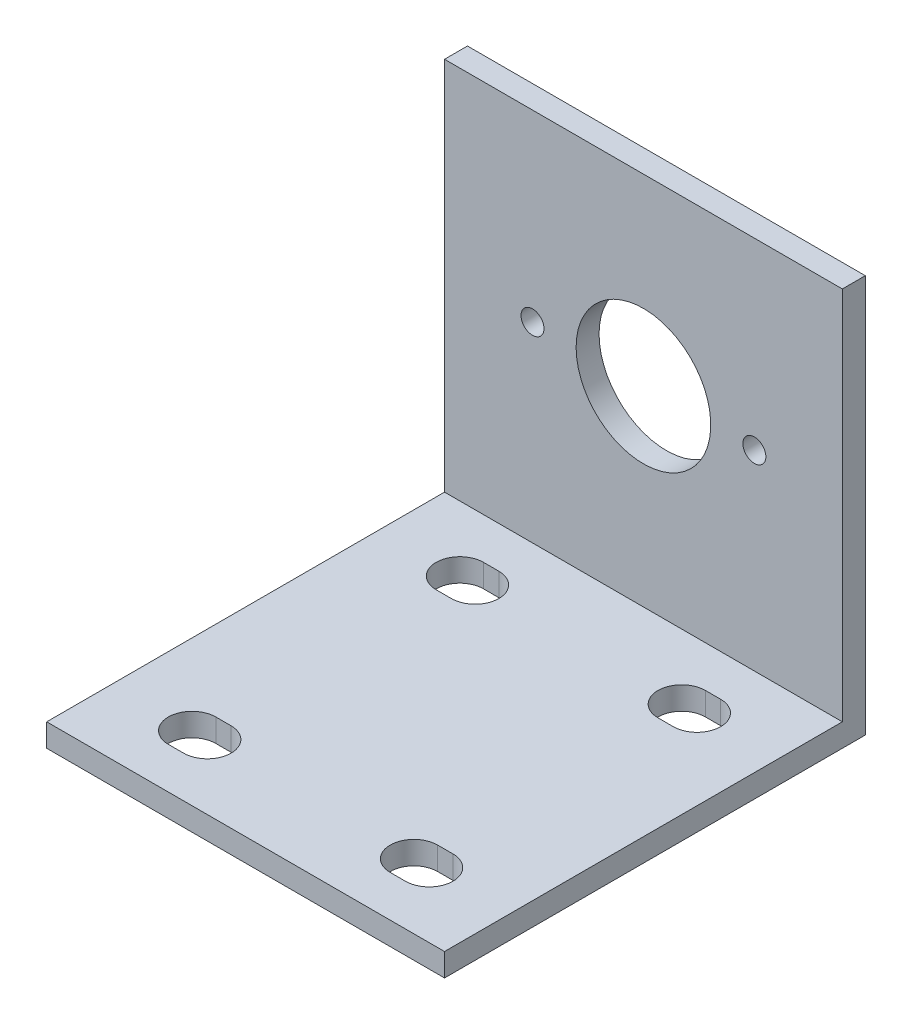
ISO-10303-21;
HEADER;
FILE_DESCRIPTION(('STEP AP214'),'2;1');
FILE_NAME('part.step','',(''),(''),'','','');
FILE_SCHEMA(('AUTOMOTIVE_DESIGN { 1 0 10303 214 1 1 1 1 }'));
ENDSEC;
DATA;
#1=APPLICATION_CONTEXT('core data for automotive mechanical design processes');
#2=APPLICATION_PROTOCOL_DEFINITION('international standard','automotive_design',2000,#1);
#3=PRODUCT_CONTEXT('',#1,'mechanical');
#4=PRODUCT('Part','Part','',(#3));
#5=PRODUCT_RELATED_PRODUCT_CATEGORY('part','',(#4));
#6=PRODUCT_DEFINITION_FORMATION('','',#4);
#7=PRODUCT_DEFINITION_CONTEXT('part definition',#1,'design');
#8=PRODUCT_DEFINITION('design','',#6,#7);
#9=PRODUCT_DEFINITION_SHAPE('','',#8);
#10=(LENGTH_UNIT() NAMED_UNIT(*) SI_UNIT(.MILLI.,.METRE.));
#11=(NAMED_UNIT(*) PLANE_ANGLE_UNIT() SI_UNIT($,.RADIAN.));
#12=(NAMED_UNIT(*) SI_UNIT($,.STERADIAN.) SOLID_ANGLE_UNIT());
#13=UNCERTAINTY_MEASURE_WITH_UNIT(LENGTH_MEASURE(1.E-05),#10,'distance_accuracy_value','');
#14=(GEOMETRIC_REPRESENTATION_CONTEXT(3) GLOBAL_UNCERTAINTY_ASSIGNED_CONTEXT((#13)) GLOBAL_UNIT_ASSIGNED_CONTEXT((#10,
#11,#12)) REPRESENTATION_CONTEXT('',''));
#15=CARTESIAN_POINT('',(0.,0.,0.));
#16=DIRECTION('',(0.,0.,1.));
#17=DIRECTION('',(1.,0.,0.));
#18=AXIS2_PLACEMENT_3D('',#15,#16,#17);
#19=CARTESIAN_POINT('',(0.,3.,0.));
#20=DIRECTION('',(0.,-1.,0.));
#21=DIRECTION('',(0.,0.,-1.));
#22=AXIS2_PLACEMENT_3D('',#19,#20,#21);
#23=PLANE('',#22);
#24=CARTESIAN_POINT('',(15.5,3.,17.5));
#25=DIRECTION('',(0.,1.,0.));
#26=DIRECTION('',(0.,0.,1.));
#27=AXIS2_PLACEMENT_3D('',#24,#25,#26);
#28=CIRCLE('',#27,3.10000000000001);
#29=CARTESIAN_POINT('',(15.5,3.,20.6));
#30=VERTEX_POINT('',#29);
#31=CARTESIAN_POINT('',(15.5,3.,14.4));
#32=VERTEX_POINT('',#31);
#33=EDGE_CURVE('E241',#30,#32,#28,.T.);
#34=ORIENTED_EDGE('',*,*,#33,.F.);
#35=DIRECTION('',(1.,0.,0.));
#36=VECTOR('',#35,1.);
#37=CARTESIAN_POINT('',(15.5,3.,20.6));
#38=LINE('',#37,#36);
#39=CARTESIAN_POINT('',(13.5,3.,20.6));
#40=VERTEX_POINT('',#39);
#41=EDGE_CURVE('E249',#40,#30,#38,.T.);
#42=ORIENTED_EDGE('',*,*,#41,.F.);
#43=CARTESIAN_POINT('',(13.5,3.,17.5));
#44=DIRECTION('',(0.,1.,0.));
#45=DIRECTION('',(0.,0.,1.));
#46=AXIS2_PLACEMENT_3D('',#43,#44,#45);
#47=CIRCLE('',#46,3.10000000000001);
#48=CARTESIAN_POINT('',(13.5,3.,14.4));
#49=VERTEX_POINT('',#48);
#50=EDGE_CURVE('E246',#49,#40,#47,.T.);
#51=ORIENTED_EDGE('',*,*,#50,.F.);
#52=DIRECTION('',(-1.,0.,0.));
#53=VECTOR('',#52,1.);
#54=CARTESIAN_POINT('',(15.5,3.,14.4));
#55=LINE('',#54,#53);
#56=EDGE_CURVE('E243',#32,#49,#55,.T.);
#57=ORIENTED_EDGE('',*,*,#56,.F.);
#58=EDGE_LOOP('',(#34,#42,#51,#57));
#59=FACE_BOUND('',#58,.T.);
#60=CARTESIAN_POINT('',(-15.5,3.,-17.5));
#61=DIRECTION('',(0.,1.,0.));
#62=DIRECTION('',(0.,0.,1.));
#63=AXIS2_PLACEMENT_3D('',#60,#61,#62);
#64=CIRCLE('',#63,3.10000000000001);
#65=CARTESIAN_POINT('',(-15.5,3.,-20.6));
#66=VERTEX_POINT('',#65);
#67=CARTESIAN_POINT('',(-15.5,3.,-14.4));
#68=VERTEX_POINT('',#67);
#69=EDGE_CURVE('E303',#66,#68,#64,.T.);
#70=ORIENTED_EDGE('',*,*,#69,.F.);
#71=DIRECTION('',(-1.,0.,0.));
#72=VECTOR('',#71,1.);
#73=CARTESIAN_POINT('',(-15.5,3.,-20.6));
#74=LINE('',#73,#72);
#75=CARTESIAN_POINT('',(-13.5,3.,-20.6));
#76=VERTEX_POINT('',#75);
#77=EDGE_CURVE('E311',#76,#66,#74,.T.);
#78=ORIENTED_EDGE('',*,*,#77,.F.);
#79=CARTESIAN_POINT('',(-13.5,3.,-17.5));
#80=DIRECTION('',(0.,1.,0.));
#81=DIRECTION('',(0.,0.,1.));
#82=AXIS2_PLACEMENT_3D('',#79,#80,#81);
#83=CIRCLE('',#82,3.10000000000001);
#84=CARTESIAN_POINT('',(-13.5,3.,-14.4));
#85=VERTEX_POINT('',#84);
#86=EDGE_CURVE('E308',#85,#76,#83,.T.);
#87=ORIENTED_EDGE('',*,*,#86,.F.);
#88=DIRECTION('',(1.,0.,0.));
#89=VECTOR('',#88,1.);
#90=CARTESIAN_POINT('',(-15.5,3.,-14.4));
#91=LINE('',#90,#89);
#92=EDGE_CURVE('E305',#68,#85,#91,.T.);
#93=ORIENTED_EDGE('',*,*,#92,.F.);
#94=EDGE_LOOP('',(#70,#78,#87,#93));
#95=FACE_BOUND('',#94,.T.);
#96=DIRECTION('',(0.,0.,1.));
#97=VECTOR('',#96,1.);
#98=CARTESIAN_POINT('',(-26.,3.,-26.));
#99=LINE('',#98,#97);
#100=CARTESIAN_POINT('',(-26.,3.,-26.));
#101=VERTEX_POINT('',#100);
#102=CARTESIAN_POINT('',(-26.,3.,26.));
#103=VERTEX_POINT('',#102);
#104=EDGE_CURVE('E334',#101,#103,#99,.T.);
#105=ORIENTED_EDGE('',*,*,#104,.T.);
#106=DIRECTION('',(1.,0.,0.));
#107=VECTOR('',#106,1.);
#108=CARTESIAN_POINT('',(26.,3.,26.));
#109=LINE('',#108,#107);
#110=CARTESIAN_POINT('',(26.,3.,26.));
#111=VERTEX_POINT('',#110);
#112=EDGE_CURVE('E337',#103,#111,#109,.T.);
#113=ORIENTED_EDGE('',*,*,#112,.T.);
#114=DIRECTION('',(0.,0.,-1.));
#115=VECTOR('',#114,1.);
#116=CARTESIAN_POINT('',(26.,3.,-26.));
#117=LINE('',#116,#115);
#118=CARTESIAN_POINT('',(26.,3.,-26.));
#119=VERTEX_POINT('',#118);
#120=EDGE_CURVE('E340',#111,#119,#117,.T.);
#121=ORIENTED_EDGE('',*,*,#120,.T.);
#122=DIRECTION('',(-1.,0.,0.));
#123=VECTOR('',#122,1.);
#124=CARTESIAN_POINT('',(26.,3.,-26.));
#125=LINE('',#124,#123);
#126=EDGE_CURVE('E343',#119,#101,#125,.T.);
#127=ORIENTED_EDGE('',*,*,#126,.T.);
#128=EDGE_LOOP('',(#105,#113,#121,#127));
#129=FACE_BOUND('',#128,.T.);
#130=CARTESIAN_POINT('',(15.5,3.,-17.5));
#131=DIRECTION('',(0.,1.,0.));
#132=DIRECTION('',(0.,0.,-1.));
#133=AXIS2_PLACEMENT_3D('',#130,#131,#132);
#134=CIRCLE('',#133,3.10000000000001);
#135=CARTESIAN_POINT('',(15.5,3.,-14.4));
#136=VERTEX_POINT('',#135);
#137=CARTESIAN_POINT('',(15.5,3.,-20.6));
#138=VERTEX_POINT('',#137);
#139=EDGE_CURVE('E272',#136,#138,#134,.T.);
#140=ORIENTED_EDGE('',*,*,#139,.F.);
#141=DIRECTION('',(1.,0.,0.));
#142=VECTOR('',#141,1.);
#143=CARTESIAN_POINT('',(15.5,3.,-14.4));
#144=LINE('',#143,#142);
#145=CARTESIAN_POINT('',(13.5,3.,-14.4));
#146=VERTEX_POINT('',#145);
#147=EDGE_CURVE('E280',#146,#136,#144,.T.);
#148=ORIENTED_EDGE('',*,*,#147,.F.);
#149=CARTESIAN_POINT('',(13.5,3.,-17.5));
#150=DIRECTION('',(0.,1.,0.));
#151=DIRECTION('',(0.,0.,-1.));
#152=AXIS2_PLACEMENT_3D('',#149,#150,#151);
#153=CIRCLE('',#152,3.10000000000001);
#154=CARTESIAN_POINT('',(13.5,3.,-20.6));
#155=VERTEX_POINT('',#154);
#156=EDGE_CURVE('E277',#155,#146,#153,.T.);
#157=ORIENTED_EDGE('',*,*,#156,.F.);
#158=DIRECTION('',(-1.,0.,0.));
#159=VECTOR('',#158,1.);
#160=CARTESIAN_POINT('',(15.5,3.,-20.6));
#161=LINE('',#160,#159);
#162=EDGE_CURVE('E274',#138,#155,#161,.T.);
#163=ORIENTED_EDGE('',*,*,#162,.F.);
#164=EDGE_LOOP('',(#140,#148,#157,#163));
#165=FACE_BOUND('',#164,.T.);
#166=CARTESIAN_POINT('',(-15.5,3.,17.5));
#167=DIRECTION('',(0.,1.,0.));
#168=DIRECTION('',(0.,0.,-1.));
#169=AXIS2_PLACEMENT_3D('',#166,#167,#168);
#170=CIRCLE('',#169,3.10000000000001);
#171=CARTESIAN_POINT('',(-15.5,3.,14.4));
#172=VERTEX_POINT('',#171);
#173=CARTESIAN_POINT('',(-15.5,3.,20.6));
#174=VERTEX_POINT('',#173);
#175=EDGE_CURVE('E217',#172,#174,#170,.T.);
#176=ORIENTED_EDGE('',*,*,#175,.F.);
#177=DIRECTION('',(-1.,0.,0.));
#178=VECTOR('',#177,1.);
#179=CARTESIAN_POINT('',(-15.5,3.,14.4));
#180=LINE('',#179,#178);
#181=CARTESIAN_POINT('',(-13.5,3.,14.4));
#182=VERTEX_POINT('',#181);
#183=EDGE_CURVE('E224',#182,#172,#180,.T.);
#184=ORIENTED_EDGE('',*,*,#183,.F.);
#185=CARTESIAN_POINT('',(-13.5,3.,17.5));
#186=DIRECTION('',(0.,1.,0.));
#187=DIRECTION('',(0.,0.,-1.));
#188=AXIS2_PLACEMENT_3D('',#185,#186,#187);
#189=CIRCLE('',#188,3.10000000000001);
#190=CARTESIAN_POINT('',(-13.5,3.,20.6));
#191=VERTEX_POINT('',#190);
#192=EDGE_CURVE('E222',#191,#182,#189,.T.);
#193=ORIENTED_EDGE('',*,*,#192,.F.);
#194=DIRECTION('',(1.,0.,0.));
#195=VECTOR('',#194,1.);
#196=CARTESIAN_POINT('',(-15.5,3.,20.6));
#197=LINE('',#196,#195);
#198=EDGE_CURVE('E219',#174,#191,#197,.T.);
#199=ORIENTED_EDGE('',*,*,#198,.F.);
#200=EDGE_LOOP('',(#176,#184,#193,#199));
#201=FACE_BOUND('',#200,.T.);
#202=ADVANCED_FACE('F34',(#59,#95,#129,#165,#201),#23,.F.);
#203=CARTESIAN_POINT('',(0.,0.,0.));
#204=DIRECTION('',(0.,-1.,0.));
#205=DIRECTION('',(0.,0.,-1.));
#206=AXIS2_PLACEMENT_3D('',#203,#204,#205);
#207=PLANE('',#206);
#208=DIRECTION('',(0.,0.,1.));
#209=VECTOR('',#208,1.);
#210=CARTESIAN_POINT('',(-26.,0.,-26.));
#211=LINE('',#210,#209);
#212=CARTESIAN_POINT('',(-26.,0.,-29.));
#213=VERTEX_POINT('',#212);
#214=CARTESIAN_POINT('',(-26.,0.,26.));
#215=VERTEX_POINT('',#214);
#216=EDGE_CURVE('E333',#213,#215,#211,.T.);
#217=ORIENTED_EDGE('',*,*,#216,.F.);
#218=DIRECTION('',(-1.,0.,0.));
#219=VECTOR('',#218,1.);
#220=CARTESIAN_POINT('',(-26.,0.,-29.));
#221=LINE('',#220,#219);
#222=CARTESIAN_POINT('',(26.,0.,-29.));
#223=VERTEX_POINT('',#222);
#224=EDGE_CURVE('E203',#223,#213,#221,.T.);
#225=ORIENTED_EDGE('',*,*,#224,.F.);
#226=DIRECTION('',(0.,0.,-1.));
#227=VECTOR('',#226,1.);
#228=CARTESIAN_POINT('',(26.,0.,-26.));
#229=LINE('',#228,#227);
#230=CARTESIAN_POINT('',(26.,0.,26.));
#231=VERTEX_POINT('',#230);
#232=EDGE_CURVE('E338',#231,#223,#229,.T.);
#233=ORIENTED_EDGE('',*,*,#232,.F.);
#234=DIRECTION('',(1.,0.,0.));
#235=VECTOR('',#234,1.);
#236=CARTESIAN_POINT('',(26.,0.,26.));
#237=LINE('',#236,#235);
#238=EDGE_CURVE('E347',#215,#231,#237,.T.);
#239=ORIENTED_EDGE('',*,*,#238,.F.);
#240=EDGE_LOOP('',(#217,#225,#233,#239));
#241=FACE_BOUND('',#240,.T.);
#242=DIRECTION('',(-1.,0.,0.));
#243=VECTOR('',#242,1.);
#244=CARTESIAN_POINT('',(-15.5,0.,-20.6));
#245=LINE('',#244,#243);
#246=CARTESIAN_POINT('',(-13.5,0.,-20.6));
#247=VERTEX_POINT('',#246);
#248=CARTESIAN_POINT('',(-15.5,0.,-20.6));
#249=VERTEX_POINT('',#248);
#250=EDGE_CURVE('E306',#247,#249,#245,.T.);
#251=ORIENTED_EDGE('',*,*,#250,.T.);
#252=CARTESIAN_POINT('',(-15.5,0.,-17.5));
#253=DIRECTION('',(0.,1.,0.));
#254=DIRECTION('',(0.,0.,1.));
#255=AXIS2_PLACEMENT_3D('',#252,#253,#254);
#256=CIRCLE('',#255,3.10000000000001);
#257=CARTESIAN_POINT('',(-15.5,0.,-14.4));
#258=VERTEX_POINT('',#257);
#259=EDGE_CURVE('E302',#249,#258,#256,.T.);
#260=ORIENTED_EDGE('',*,*,#259,.T.);
#261=DIRECTION('',(1.,0.,0.));
#262=VECTOR('',#261,1.);
#263=CARTESIAN_POINT('',(-15.5,0.,-14.4));
#264=LINE('',#263,#262);
#265=CARTESIAN_POINT('',(-13.5,0.,-14.4));
#266=VERTEX_POINT('',#265);
#267=EDGE_CURVE('E316',#258,#266,#264,.T.);
#268=ORIENTED_EDGE('',*,*,#267,.T.);
#269=CARTESIAN_POINT('',(-13.5,0.,-17.5));
#270=DIRECTION('',(0.,1.,0.));
#271=DIRECTION('',(0.,0.,1.));
#272=AXIS2_PLACEMENT_3D('',#269,#270,#271);
#273=CIRCLE('',#272,3.10000000000001);
#274=EDGE_CURVE('E319',#266,#247,#273,.T.);
#275=ORIENTED_EDGE('',*,*,#274,.T.);
#276=EDGE_LOOP('',(#251,#260,#268,#275));
#277=FACE_BOUND('',#276,.T.);
#278=DIRECTION('',(1.,0.,0.));
#279=VECTOR('',#278,1.);
#280=CARTESIAN_POINT('',(15.5,0.,-14.4));
#281=LINE('',#280,#279);
#282=CARTESIAN_POINT('',(13.5,0.,-14.4));
#283=VERTEX_POINT('',#282);
#284=CARTESIAN_POINT('',(15.5,0.,-14.4));
#285=VERTEX_POINT('',#284);
#286=EDGE_CURVE('E275',#283,#285,#281,.T.);
#287=ORIENTED_EDGE('',*,*,#286,.T.);
#288=CARTESIAN_POINT('',(15.5,0.,-17.5));
#289=DIRECTION('',(0.,1.,0.));
#290=DIRECTION('',(0.,0.,-1.));
#291=AXIS2_PLACEMENT_3D('',#288,#289,#290);
#292=CIRCLE('',#291,3.10000000000001);
#293=CARTESIAN_POINT('',(15.5,0.,-20.6));
#294=VERTEX_POINT('',#293);
#295=EDGE_CURVE('E271',#285,#294,#292,.T.);
#296=ORIENTED_EDGE('',*,*,#295,.T.);
#297=DIRECTION('',(-1.,0.,0.));
#298=VECTOR('',#297,1.);
#299=CARTESIAN_POINT('',(15.5,0.,-20.6));
#300=LINE('',#299,#298);
#301=CARTESIAN_POINT('',(13.5,0.,-20.6));
#302=VERTEX_POINT('',#301);
#303=EDGE_CURVE('E285',#294,#302,#300,.T.);
#304=ORIENTED_EDGE('',*,*,#303,.T.);
#305=CARTESIAN_POINT('',(13.5,0.,-17.5));
#306=DIRECTION('',(0.,1.,0.));
#307=DIRECTION('',(0.,0.,-1.));
#308=AXIS2_PLACEMENT_3D('',#305,#306,#307);
#309=CIRCLE('',#308,3.10000000000001);
#310=EDGE_CURVE('E288',#302,#283,#309,.T.);
#311=ORIENTED_EDGE('',*,*,#310,.T.);
#312=EDGE_LOOP('',(#287,#296,#304,#311));
#313=FACE_BOUND('',#312,.T.);
#314=DIRECTION('',(1.,0.,0.));
#315=VECTOR('',#314,1.);
#316=CARTESIAN_POINT('',(15.5,0.,20.6));
#317=LINE('',#316,#315);
#318=CARTESIAN_POINT('',(13.5,0.,20.6));
#319=VERTEX_POINT('',#318);
#320=CARTESIAN_POINT('',(15.5,0.,20.6));
#321=VERTEX_POINT('',#320);
#322=EDGE_CURVE('E244',#319,#321,#317,.T.);
#323=ORIENTED_EDGE('',*,*,#322,.T.);
#324=CARTESIAN_POINT('',(15.5,0.,17.5));
#325=DIRECTION('',(0.,1.,0.));
#326=DIRECTION('',(0.,0.,1.));
#327=AXIS2_PLACEMENT_3D('',#324,#325,#326);
#328=CIRCLE('',#327,3.10000000000001);
#329=CARTESIAN_POINT('',(15.5,0.,14.4));
#330=VERTEX_POINT('',#329);
#331=EDGE_CURVE('E240',#321,#330,#328,.T.);
#332=ORIENTED_EDGE('',*,*,#331,.T.);
#333=DIRECTION('',(-1.,0.,0.));
#334=VECTOR('',#333,1.);
#335=CARTESIAN_POINT('',(15.5,0.,14.4));
#336=LINE('',#335,#334);
#337=CARTESIAN_POINT('',(13.5,0.,14.4));
#338=VERTEX_POINT('',#337);
#339=EDGE_CURVE('E254',#330,#338,#336,.T.);
#340=ORIENTED_EDGE('',*,*,#339,.T.);
#341=CARTESIAN_POINT('',(13.5,0.,17.5));
#342=DIRECTION('',(0.,1.,0.));
#343=DIRECTION('',(0.,0.,1.));
#344=AXIS2_PLACEMENT_3D('',#341,#342,#343);
#345=CIRCLE('',#344,3.10000000000001);
#346=EDGE_CURVE('E257',#338,#319,#345,.T.);
#347=ORIENTED_EDGE('',*,*,#346,.T.);
#348=EDGE_LOOP('',(#323,#332,#340,#347));
#349=FACE_BOUND('',#348,.T.);
#350=DIRECTION('',(-1.,0.,0.));
#351=VECTOR('',#350,1.);
#352=CARTESIAN_POINT('',(-15.5,0.,14.4));
#353=LINE('',#352,#351);
#354=CARTESIAN_POINT('',(-13.5,0.,14.4));
#355=VERTEX_POINT('',#354);
#356=CARTESIAN_POINT('',(-15.5,0.,14.4));
#357=VERTEX_POINT('',#356);
#358=EDGE_CURVE('E220',#355,#357,#353,.T.);
#359=ORIENTED_EDGE('',*,*,#358,.T.);
#360=CARTESIAN_POINT('',(-15.5,0.,17.5));
#361=DIRECTION('',(0.,1.,0.));
#362=DIRECTION('',(0.,0.,-1.));
#363=AXIS2_PLACEMENT_3D('',#360,#361,#362);
#364=CIRCLE('',#363,3.10000000000001);
#365=CARTESIAN_POINT('',(-15.5,0.,20.6));
#366=VERTEX_POINT('',#365);
#367=EDGE_CURVE('E57',#357,#366,#364,.T.);
#368=ORIENTED_EDGE('',*,*,#367,.T.);
#369=DIRECTION('',(1.,0.,0.));
#370=VECTOR('',#369,1.);
#371=CARTESIAN_POINT('',(-15.5,0.,20.6));
#372=LINE('',#371,#370);
#373=CARTESIAN_POINT('',(-13.5,0.,20.6));
#374=VERTEX_POINT('',#373);
#375=EDGE_CURVE('E212',#366,#374,#372,.T.);
#376=ORIENTED_EDGE('',*,*,#375,.T.);
#377=CARTESIAN_POINT('',(-13.5,0.,17.5));
#378=DIRECTION('',(0.,1.,0.));
#379=DIRECTION('',(0.,0.,-1.));
#380=AXIS2_PLACEMENT_3D('',#377,#378,#379);
#381=CIRCLE('',#380,3.10000000000001);
#382=EDGE_CURVE('E229',#374,#355,#381,.T.);
#383=ORIENTED_EDGE('',*,*,#382,.T.);
#384=EDGE_LOOP('',(#359,#368,#376,#383));
#385=FACE_BOUND('',#384,.T.);
#386=ADVANCED_FACE('F358',(#241,#277,#313,#349,#385),#207,.T.);
#387=CARTESIAN_POINT('',(-26.,3.,-26.));
#388=DIRECTION('',(1.,0.,0.));
#389=DIRECTION('',(0.,0.,-1.));
#390=AXIS2_PLACEMENT_3D('',#387,#388,#389);
#391=PLANE('',#390);
#392=ORIENTED_EDGE('',*,*,#216,.T.);
#393=DIRECTION('',(0.,-1.,0.));
#394=VECTOR('',#393,1.);
#395=CARTESIAN_POINT('',(-26.,3.,26.));
#396=LINE('',#395,#394);
#397=EDGE_CURVE('E11',#103,#215,#396,.T.);
#398=ORIENTED_EDGE('',*,*,#397,.F.);
#399=ORIENTED_EDGE('',*,*,#104,.F.);
#400=DIRECTION('',(0.,1.,0.));
#401=VECTOR('',#400,1.);
#402=CARTESIAN_POINT('',(-26.,0.,-26.));
#403=LINE('',#402,#401);
#404=CARTESIAN_POINT('',(-26.,52.,-26.));
#405=VERTEX_POINT('',#404);
#406=EDGE_CURVE('E209',#101,#405,#403,.T.);
#407=ORIENTED_EDGE('',*,*,#406,.T.);
#408=DIRECTION('',(0.,0.,1.));
#409=VECTOR('',#408,1.);
#410=CARTESIAN_POINT('',(-26.,52.,-29.));
#411=LINE('',#410,#409);
#412=CARTESIAN_POINT('',(-26.,52.,-29.));
#413=VERTEX_POINT('',#412);
#414=EDGE_CURVE('E189',#413,#405,#411,.T.);
#415=ORIENTED_EDGE('',*,*,#414,.F.);
#416=DIRECTION('',(0.,1.,0.));
#417=VECTOR('',#416,1.);
#418=CARTESIAN_POINT('',(-26.,0.,-29.));
#419=LINE('',#418,#417);
#420=EDGE_CURVE('E196',#213,#413,#419,.T.);
#421=ORIENTED_EDGE('',*,*,#420,.F.);
#422=EDGE_LOOP('',(#392,#398,#399,#407,#415,#421));
#423=FACE_BOUND('',#422,.T.);
#424=ADVANCED_FACE('F36',(#423),#391,.F.);
#425=CARTESIAN_POINT('',(26.,3.,26.));
#426=DIRECTION('',(0.,0.,-1.));
#427=DIRECTION('',(-1.,0.,0.));
#428=AXIS2_PLACEMENT_3D('',#425,#426,#427);
#429=PLANE('',#428);
#430=ORIENTED_EDGE('',*,*,#238,.T.);
#431=DIRECTION('',(0.,-1.,0.));
#432=VECTOR('',#431,1.);
#433=CARTESIAN_POINT('',(26.,3.,26.));
#434=LINE('',#433,#432);
#435=EDGE_CURVE('E42',#111,#231,#434,.T.);
#436=ORIENTED_EDGE('',*,*,#435,.F.);
#437=ORIENTED_EDGE('',*,*,#112,.F.);
#438=ORIENTED_EDGE('',*,*,#397,.T.);
#439=EDGE_LOOP('',(#430,#436,#437,#438));
#440=FACE_BOUND('',#439,.T.);
#441=ADVANCED_FACE('F371',(#440),#429,.F.);
#442=CARTESIAN_POINT('',(26.,3.,-26.));
#443=DIRECTION('',(-1.,0.,0.));
#444=DIRECTION('',(0.,0.,1.));
#445=AXIS2_PLACEMENT_3D('',#442,#443,#444);
#446=PLANE('',#445);
#447=ORIENTED_EDGE('',*,*,#232,.T.);
#448=DIRECTION('',(0.,-1.,0.));
#449=VECTOR('',#448,1.);
#450=CARTESIAN_POINT('',(26.,0.,-29.));
#451=LINE('',#450,#449);
#452=CARTESIAN_POINT('',(26.,52.,-29.));
#453=VERTEX_POINT('',#452);
#454=EDGE_CURVE('E195',#453,#223,#451,.T.);
#455=ORIENTED_EDGE('',*,*,#454,.F.);
#456=DIRECTION('',(0.,0.,1.));
#457=VECTOR('',#456,1.);
#458=CARTESIAN_POINT('',(26.,52.,-29.));
#459=LINE('',#458,#457);
#460=CARTESIAN_POINT('',(26.,52.,-26.));
#461=VERTEX_POINT('',#460);
#462=EDGE_CURVE('E191',#453,#461,#459,.T.);
#463=ORIENTED_EDGE('',*,*,#462,.T.);
#464=DIRECTION('',(0.,-1.,0.));
#465=VECTOR('',#464,1.);
#466=CARTESIAN_POINT('',(26.,0.,-26.));
#467=LINE('',#466,#465);
#468=EDGE_CURVE('E206',#461,#119,#467,.T.);
#469=ORIENTED_EDGE('',*,*,#468,.T.);
#470=ORIENTED_EDGE('',*,*,#120,.F.);
#471=ORIENTED_EDGE('',*,*,#435,.T.);
#472=EDGE_LOOP('',(#447,#455,#463,#469,#470,#471));
#473=FACE_BOUND('',#472,.T.);
#474=ADVANCED_FACE('F354',(#473),#446,.F.);
#475=CARTESIAN_POINT('',(-15.5,3.,-17.5));
#476=DIRECTION('',(0.,-1.,0.));
#477=DIRECTION('',(0.,0.,-1.));
#478=AXIS2_PLACEMENT_3D('',#475,#476,#477);
#479=CYLINDRICAL_SURFACE('',#478,3.10000000000001);
#480=ORIENTED_EDGE('',*,*,#259,.F.);
#481=DIRECTION('',(0.,-1.,0.));
#482=VECTOR('',#481,1.);
#483=CARTESIAN_POINT('',(-15.5,3.,-20.6));
#484=LINE('',#483,#482);
#485=EDGE_CURVE('E313',#66,#249,#484,.T.);
#486=ORIENTED_EDGE('',*,*,#485,.F.);
#487=ORIENTED_EDGE('',*,*,#69,.T.);
#488=DIRECTION('',(0.,-1.,0.));
#489=VECTOR('',#488,1.);
#490=CARTESIAN_POINT('',(-15.5,3.,-14.4));
#491=LINE('',#490,#489);
#492=EDGE_CURVE('E330',#68,#258,#491,.T.);
#493=ORIENTED_EDGE('',*,*,#492,.T.);
#494=EDGE_LOOP('',(#480,#486,#487,#493));
#495=FACE_BOUND('',#494,.T.);
#496=ADVANCED_FACE('F377',(#495),#479,.F.);
#497=CARTESIAN_POINT('',(-15.5,3.,-14.4));
#498=DIRECTION('',(0.,0.,-1.));
#499=DIRECTION('',(-1.,0.,0.));
#500=AXIS2_PLACEMENT_3D('',#497,#498,#499);
#501=PLANE('',#500);
#502=ORIENTED_EDGE('',*,*,#267,.F.);
#503=ORIENTED_EDGE('',*,*,#492,.F.);
#504=ORIENTED_EDGE('',*,*,#92,.T.);
#505=DIRECTION('',(0.,-1.,0.));
#506=VECTOR('',#505,1.);
#507=CARTESIAN_POINT('',(-13.5,3.,-14.4));
#508=LINE('',#507,#506);
#509=EDGE_CURVE('E328',#85,#266,#508,.T.);
#510=ORIENTED_EDGE('',*,*,#509,.T.);
#511=EDGE_LOOP('',(#502,#503,#504,#510));
#512=FACE_BOUND('',#511,.T.);
#513=ADVANCED_FACE('F391',(#512),#501,.T.);
#514=CARTESIAN_POINT('',(-13.5,3.,-17.5));
#515=DIRECTION('',(0.,-1.,0.));
#516=DIRECTION('',(0.,0.,-1.));
#517=AXIS2_PLACEMENT_3D('',#514,#515,#516);
#518=CYLINDRICAL_SURFACE('',#517,3.10000000000001);
#519=ORIENTED_EDGE('',*,*,#274,.F.);
#520=ORIENTED_EDGE('',*,*,#509,.F.);
#521=ORIENTED_EDGE('',*,*,#86,.T.);
#522=DIRECTION('',(0.,-1.,0.));
#523=VECTOR('',#522,1.);
#524=CARTESIAN_POINT('',(-13.5,3.,-20.6));
#525=LINE('',#524,#523);
#526=EDGE_CURVE('E326',#76,#247,#525,.T.);
#527=ORIENTED_EDGE('',*,*,#526,.T.);
#528=EDGE_LOOP('',(#519,#520,#521,#527));
#529=FACE_BOUND('',#528,.T.);
#530=ADVANCED_FACE('F395',(#529),#518,.F.);
#531=CARTESIAN_POINT('',(-15.5,3.,-20.6));
#532=DIRECTION('',(0.,0.,1.));
#533=DIRECTION('',(1.,0.,0.));
#534=AXIS2_PLACEMENT_3D('',#531,#532,#533);
#535=PLANE('',#534);
#536=ORIENTED_EDGE('',*,*,#250,.F.);
#537=ORIENTED_EDGE('',*,*,#526,.F.);
#538=ORIENTED_EDGE('',*,*,#77,.T.);
#539=ORIENTED_EDGE('',*,*,#485,.T.);
#540=EDGE_LOOP('',(#536,#537,#538,#539));
#541=FACE_BOUND('',#540,.T.);
#542=ADVANCED_FACE('F399',(#541),#535,.T.);
#543=CARTESIAN_POINT('',(15.5,3.,-17.5));
#544=DIRECTION('',(0.,-1.,0.));
#545=DIRECTION('',(0.,0.,-1.));
#546=AXIS2_PLACEMENT_3D('',#543,#544,#545);
#547=CYLINDRICAL_SURFACE('',#546,3.10000000000001);
#548=ORIENTED_EDGE('',*,*,#295,.F.);
#549=DIRECTION('',(0.,-1.,0.));
#550=VECTOR('',#549,1.);
#551=CARTESIAN_POINT('',(15.5,3.,-14.4));
#552=LINE('',#551,#550);
#553=EDGE_CURVE('E282',#136,#285,#552,.T.);
#554=ORIENTED_EDGE('',*,*,#553,.F.);
#555=ORIENTED_EDGE('',*,*,#139,.T.);
#556=DIRECTION('',(0.,-1.,0.));
#557=VECTOR('',#556,1.);
#558=CARTESIAN_POINT('',(15.5,3.,-20.6));
#559=LINE('',#558,#557);
#560=EDGE_CURVE('E299',#138,#294,#559,.T.);
#561=ORIENTED_EDGE('',*,*,#560,.T.);
#562=EDGE_LOOP('',(#548,#554,#555,#561));
#563=FACE_BOUND('',#562,.T.);
#564=ADVANCED_FACE('F403',(#563),#547,.F.);
#565=CARTESIAN_POINT('',(15.5,3.,-20.6));
#566=DIRECTION('',(0.,0.,1.));
#567=DIRECTION('',(1.,0.,0.));
#568=AXIS2_PLACEMENT_3D('',#565,#566,#567);
#569=PLANE('',#568);
#570=ORIENTED_EDGE('',*,*,#303,.F.);
#571=ORIENTED_EDGE('',*,*,#560,.F.);
#572=ORIENTED_EDGE('',*,*,#162,.T.);
#573=DIRECTION('',(0.,-1.,0.));
#574=VECTOR('',#573,1.);
#575=CARTESIAN_POINT('',(13.5,3.,-20.6));
#576=LINE('',#575,#574);
#577=EDGE_CURVE('E297',#155,#302,#576,.T.);
#578=ORIENTED_EDGE('',*,*,#577,.T.);
#579=EDGE_LOOP('',(#570,#571,#572,#578));
#580=FACE_BOUND('',#579,.T.);
#581=ADVANCED_FACE('F407',(#580),#569,.T.);
#582=CARTESIAN_POINT('',(13.5,3.,-17.5));
#583=DIRECTION('',(0.,-1.,0.));
#584=DIRECTION('',(0.,0.,-1.));
#585=AXIS2_PLACEMENT_3D('',#582,#583,#584);
#586=CYLINDRICAL_SURFACE('',#585,3.10000000000001);
#587=ORIENTED_EDGE('',*,*,#310,.F.);
#588=ORIENTED_EDGE('',*,*,#577,.F.);
#589=ORIENTED_EDGE('',*,*,#156,.T.);
#590=DIRECTION('',(0.,-1.,0.));
#591=VECTOR('',#590,1.);
#592=CARTESIAN_POINT('',(13.5,3.,-14.4));
#593=LINE('',#592,#591);
#594=EDGE_CURVE('E295',#146,#283,#593,.T.);
#595=ORIENTED_EDGE('',*,*,#594,.T.);
#596=EDGE_LOOP('',(#587,#588,#589,#595));
#597=FACE_BOUND('',#596,.T.);
#598=ADVANCED_FACE('F411',(#597),#586,.F.);
#599=CARTESIAN_POINT('',(15.5,3.,-14.4));
#600=DIRECTION('',(0.,0.,-1.));
#601=DIRECTION('',(-1.,0.,0.));
#602=AXIS2_PLACEMENT_3D('',#599,#600,#601);
#603=PLANE('',#602);
#604=ORIENTED_EDGE('',*,*,#286,.F.);
#605=ORIENTED_EDGE('',*,*,#594,.F.);
#606=ORIENTED_EDGE('',*,*,#147,.T.);
#607=ORIENTED_EDGE('',*,*,#553,.T.);
#608=EDGE_LOOP('',(#604,#605,#606,#607));
#609=FACE_BOUND('',#608,.T.);
#610=ADVANCED_FACE('F415',(#609),#603,.T.);
#611=CARTESIAN_POINT('',(15.5,3.,17.5));
#612=DIRECTION('',(0.,-1.,0.));
#613=DIRECTION('',(0.,0.,-1.));
#614=AXIS2_PLACEMENT_3D('',#611,#612,#613);
#615=CYLINDRICAL_SURFACE('',#614,3.10000000000001);
#616=ORIENTED_EDGE('',*,*,#331,.F.);
#617=DIRECTION('',(0.,-1.,0.));
#618=VECTOR('',#617,1.);
#619=CARTESIAN_POINT('',(15.5,3.,20.6));
#620=LINE('',#619,#618);
#621=EDGE_CURVE('E251',#30,#321,#620,.T.);
#622=ORIENTED_EDGE('',*,*,#621,.F.);
#623=ORIENTED_EDGE('',*,*,#33,.T.);
#624=DIRECTION('',(0.,-1.,0.));
#625=VECTOR('',#624,1.);
#626=CARTESIAN_POINT('',(15.5,3.,14.4));
#627=LINE('',#626,#625);
#628=EDGE_CURVE('E268',#32,#330,#627,.T.);
#629=ORIENTED_EDGE('',*,*,#628,.T.);
#630=EDGE_LOOP('',(#616,#622,#623,#629));
#631=FACE_BOUND('',#630,.T.);
#632=ADVANCED_FACE('F419',(#631),#615,.F.);
#633=CARTESIAN_POINT('',(15.5,3.,14.4));
#634=DIRECTION('',(0.,0.,1.));
#635=DIRECTION('',(1.,0.,0.));
#636=AXIS2_PLACEMENT_3D('',#633,#634,#635);
#637=PLANE('',#636);
#638=ORIENTED_EDGE('',*,*,#339,.F.);
#639=ORIENTED_EDGE('',*,*,#628,.F.);
#640=ORIENTED_EDGE('',*,*,#56,.T.);
#641=DIRECTION('',(0.,-1.,0.));
#642=VECTOR('',#641,1.);
#643=CARTESIAN_POINT('',(13.5,3.,14.4));
#644=LINE('',#643,#642);
#645=EDGE_CURVE('E266',#49,#338,#644,.T.);
#646=ORIENTED_EDGE('',*,*,#645,.T.);
#647=EDGE_LOOP('',(#638,#639,#640,#646));
#648=FACE_BOUND('',#647,.T.);
#649=ADVANCED_FACE('F423',(#648),#637,.T.);
#650=CARTESIAN_POINT('',(13.5,3.,17.5));
#651=DIRECTION('',(0.,-1.,0.));
#652=DIRECTION('',(0.,0.,-1.));
#653=AXIS2_PLACEMENT_3D('',#650,#651,#652);
#654=CYLINDRICAL_SURFACE('',#653,3.10000000000001);
#655=ORIENTED_EDGE('',*,*,#346,.F.);
#656=ORIENTED_EDGE('',*,*,#645,.F.);
#657=ORIENTED_EDGE('',*,*,#50,.T.);
#658=DIRECTION('',(0.,-1.,0.));
#659=VECTOR('',#658,1.);
#660=CARTESIAN_POINT('',(13.5,3.,20.6));
#661=LINE('',#660,#659);
#662=EDGE_CURVE('E264',#40,#319,#661,.T.);
#663=ORIENTED_EDGE('',*,*,#662,.T.);
#664=EDGE_LOOP('',(#655,#656,#657,#663));
#665=FACE_BOUND('',#664,.T.);
#666=ADVANCED_FACE('F427',(#665),#654,.F.);
#667=CARTESIAN_POINT('',(15.5,3.,20.6));
#668=DIRECTION('',(0.,0.,-1.));
#669=DIRECTION('',(-1.,0.,0.));
#670=AXIS2_PLACEMENT_3D('',#667,#668,#669);
#671=PLANE('',#670);
#672=ORIENTED_EDGE('',*,*,#322,.F.);
#673=ORIENTED_EDGE('',*,*,#662,.F.);
#674=ORIENTED_EDGE('',*,*,#41,.T.);
#675=ORIENTED_EDGE('',*,*,#621,.T.);
#676=EDGE_LOOP('',(#672,#673,#674,#675));
#677=FACE_BOUND('',#676,.T.);
#678=ADVANCED_FACE('F431',(#677),#671,.T.);
#679=CARTESIAN_POINT('',(-15.5,3.,17.5));
#680=DIRECTION('',(0.,-1.,0.));
#681=DIRECTION('',(0.,0.,-1.));
#682=AXIS2_PLACEMENT_3D('',#679,#680,#681);
#683=CYLINDRICAL_SURFACE('',#682,3.10000000000001);
#684=ORIENTED_EDGE('',*,*,#367,.F.);
#685=DIRECTION('',(0.,-1.,0.));
#686=VECTOR('',#685,1.);
#687=CARTESIAN_POINT('',(-15.5,3.,14.4));
#688=LINE('',#687,#686);
#689=EDGE_CURVE('E225',#172,#357,#688,.T.);
#690=ORIENTED_EDGE('',*,*,#689,.F.);
#691=ORIENTED_EDGE('',*,*,#175,.T.);
#692=DIRECTION('',(0.,-1.,0.));
#693=VECTOR('',#692,1.);
#694=CARTESIAN_POINT('',(-15.5,3.,20.6));
#695=LINE('',#694,#693);
#696=EDGE_CURVE('E238',#174,#366,#695,.T.);
#697=ORIENTED_EDGE('',*,*,#696,.T.);
#698=EDGE_LOOP('',(#684,#690,#691,#697));
#699=FACE_BOUND('',#698,.T.);
#700=ADVANCED_FACE('F435',(#699),#683,.F.);
#701=CARTESIAN_POINT('',(-15.5,3.,20.6));
#702=DIRECTION('',(0.,0.,-1.));
#703=DIRECTION('',(-1.,0.,0.));
#704=AXIS2_PLACEMENT_3D('',#701,#702,#703);
#705=PLANE('',#704);
#706=ORIENTED_EDGE('',*,*,#375,.F.);
#707=ORIENTED_EDGE('',*,*,#696,.F.);
#708=ORIENTED_EDGE('',*,*,#198,.T.);
#709=DIRECTION('',(0.,-1.,0.));
#710=VECTOR('',#709,1.);
#711=CARTESIAN_POINT('',(-13.5,3.,20.6));
#712=LINE('',#711,#710);
#713=EDGE_CURVE('E236',#191,#374,#712,.T.);
#714=ORIENTED_EDGE('',*,*,#713,.T.);
#715=EDGE_LOOP('',(#706,#707,#708,#714));
#716=FACE_BOUND('',#715,.T.);
#717=ADVANCED_FACE('F439',(#716),#705,.T.);
#718=CARTESIAN_POINT('',(-13.5,3.,17.5));
#719=DIRECTION('',(0.,-1.,0.));
#720=DIRECTION('',(0.,0.,-1.));
#721=AXIS2_PLACEMENT_3D('',#718,#719,#720);
#722=CYLINDRICAL_SURFACE('',#721,3.10000000000001);
#723=ORIENTED_EDGE('',*,*,#382,.F.);
#724=ORIENTED_EDGE('',*,*,#713,.F.);
#725=ORIENTED_EDGE('',*,*,#192,.T.);
#726=DIRECTION('',(0.,-1.,0.));
#727=VECTOR('',#726,1.);
#728=CARTESIAN_POINT('',(-13.5,3.,14.4));
#729=LINE('',#728,#727);
#730=EDGE_CURVE('E49',#182,#355,#729,.T.);
#731=ORIENTED_EDGE('',*,*,#730,.T.);
#732=EDGE_LOOP('',(#723,#724,#725,#731));
#733=FACE_BOUND('',#732,.T.);
#734=ADVANCED_FACE('F442',(#733),#722,.F.);
#735=CARTESIAN_POINT('',(-15.5,3.,14.4));
#736=DIRECTION('',(0.,0.,1.));
#737=DIRECTION('',(1.,0.,0.));
#738=AXIS2_PLACEMENT_3D('',#735,#736,#737);
#739=PLANE('',#738);
#740=ORIENTED_EDGE('',*,*,#358,.F.);
#741=ORIENTED_EDGE('',*,*,#730,.F.);
#742=ORIENTED_EDGE('',*,*,#183,.T.);
#743=ORIENTED_EDGE('',*,*,#689,.T.);
#744=EDGE_LOOP('',(#740,#741,#742,#743));
#745=FACE_BOUND('',#744,.T.);
#746=ADVANCED_FACE('F446',(#745),#739,.T.);
#747=CARTESIAN_POINT('',(0.,0.,-29.));
#748=DIRECTION('',(0.,0.,-1.));
#749=DIRECTION('',(-1.,0.,0.));
#750=AXIS2_PLACEMENT_3D('',#747,#748,#749);
#751=PLANE('',#750);
#752=CARTESIAN_POINT('',(-14.5,28.,-29.));
#753=DIRECTION('',(0.,0.,-1.));
#754=DIRECTION('',(-1.,0.,0.));
#755=AXIS2_PLACEMENT_3D('',#752,#753,#754);
#756=CIRCLE('',#755,1.5);
#757=CARTESIAN_POINT('',(-16.,28.,-29.));
#758=VERTEX_POINT('',#757);
#759=EDGE_CURVE('E483',#758,#758,#756,.T.);
#760=ORIENTED_EDGE('',*,*,#759,.F.);
#761=EDGE_LOOP('',(#760));
#762=FACE_BOUND('',#761,.T.);
#763=ORIENTED_EDGE('',*,*,#420,.T.);
#764=DIRECTION('',(1.,0.,0.));
#765=VECTOR('',#764,1.);
#766=CARTESIAN_POINT('',(-26.,52.,-29.));
#767=LINE('',#766,#765);
#768=EDGE_CURVE('E185',#413,#453,#767,.T.);
#769=ORIENTED_EDGE('',*,*,#768,.T.);
#770=ORIENTED_EDGE('',*,*,#454,.T.);
#771=ORIENTED_EDGE('',*,*,#224,.T.);
#772=EDGE_LOOP('',(#763,#769,#770,#771));
#773=FACE_BOUND('',#772,.T.);
#774=CARTESIAN_POINT('',(14.5,28.,-29.));
#775=DIRECTION('',(0.,0.,-1.));
#776=DIRECTION('',(-1.,0.,0.));
#777=AXIS2_PLACEMENT_3D('',#774,#775,#776);
#778=CIRCLE('',#777,1.5);
#779=CARTESIAN_POINT('',(13.,28.,-29.));
#780=VERTEX_POINT('',#779);
#781=EDGE_CURVE('E365',#780,#780,#778,.T.);
#782=ORIENTED_EDGE('',*,*,#781,.F.);
#783=EDGE_LOOP('',(#782));
#784=FACE_BOUND('',#783,.T.);
#785=CARTESIAN_POINT('',(0.,28.,-29.));
#786=DIRECTION('',(0.,0.,-1.));
#787=DIRECTION('',(-1.,0.,0.));
#788=AXIS2_PLACEMENT_3D('',#785,#786,#787);
#789=CIRCLE('',#788,8.8);
#790=CARTESIAN_POINT('',(-8.8,28.,-29.));
#791=VERTEX_POINT('',#790);
#792=EDGE_CURVE('E474',#791,#791,#789,.T.);
#793=ORIENTED_EDGE('',*,*,#792,.F.);
#794=EDGE_LOOP('',(#793));
#795=FACE_BOUND('',#794,.T.);
#796=ADVANCED_FACE('F200',(#762,#773,#784,#795),#751,.T.);
#797=CARTESIAN_POINT('',(0.,0.,-26.));
#798=DIRECTION('',(0.,0.,-1.));
#799=DIRECTION('',(-1.,0.,0.));
#800=AXIS2_PLACEMENT_3D('',#797,#798,#799);
#801=PLANE('',#800);
#802=ORIENTED_EDGE('',*,*,#126,.F.);
#803=ORIENTED_EDGE('',*,*,#468,.F.);
#804=DIRECTION('',(1.,0.,0.));
#805=VECTOR('',#804,1.);
#806=CARTESIAN_POINT('',(-26.,52.,-26.));
#807=LINE('',#806,#805);
#808=EDGE_CURVE('E364',#405,#461,#807,.T.);
#809=ORIENTED_EDGE('',*,*,#808,.F.);
#810=ORIENTED_EDGE('',*,*,#406,.F.);
#811=EDGE_LOOP('',(#802,#803,#809,#810));
#812=FACE_BOUND('',#811,.T.);
#813=CARTESIAN_POINT('',(14.5,28.,-26.));
#814=DIRECTION('',(0.,0.,-1.));
#815=DIRECTION('',(-1.,0.,0.));
#816=AXIS2_PLACEMENT_3D('',#813,#814,#815);
#817=CIRCLE('',#816,1.5);
#818=CARTESIAN_POINT('',(13.,28.,-26.));
#819=VERTEX_POINT('',#818);
#820=EDGE_CURVE('E486',#819,#819,#817,.T.);
#821=ORIENTED_EDGE('',*,*,#820,.T.);
#822=EDGE_LOOP('',(#821));
#823=FACE_BOUND('',#822,.T.);
#824=CARTESIAN_POINT('',(-14.5,28.,-26.));
#825=DIRECTION('',(0.,0.,-1.));
#826=DIRECTION('',(-1.,0.,0.));
#827=AXIS2_PLACEMENT_3D('',#824,#825,#826);
#828=CIRCLE('',#827,1.5);
#829=CARTESIAN_POINT('',(-16.,28.,-26.));
#830=VERTEX_POINT('',#829);
#831=EDGE_CURVE('E480',#830,#830,#828,.T.);
#832=ORIENTED_EDGE('',*,*,#831,.T.);
#833=EDGE_LOOP('',(#832));
#834=FACE_BOUND('',#833,.T.);
#835=CARTESIAN_POINT('',(0.,28.,-26.));
#836=DIRECTION('',(0.,0.,-1.));
#837=DIRECTION('',(-1.,0.,0.));
#838=AXIS2_PLACEMENT_3D('',#835,#836,#837);
#839=CIRCLE('',#838,8.8);
#840=CARTESIAN_POINT('',(-8.8,28.,-26.));
#841=VERTEX_POINT('',#840);
#842=EDGE_CURVE('E477',#841,#841,#839,.T.);
#843=ORIENTED_EDGE('',*,*,#842,.T.);
#844=EDGE_LOOP('',(#843));
#845=FACE_BOUND('',#844,.T.);
#846=ADVANCED_FACE('F453',(#812,#823,#834,#845),#801,.F.);
#847=CARTESIAN_POINT('',(-26.,52.,-29.));
#848=DIRECTION('',(0.,-1.,0.));
#849=DIRECTION('',(1.,0.,0.));
#850=AXIS2_PLACEMENT_3D('',#847,#848,#849);
#851=PLANE('',#850);
#852=ORIENTED_EDGE('',*,*,#808,.T.);
#853=ORIENTED_EDGE('',*,*,#462,.F.);
#854=ORIENTED_EDGE('',*,*,#768,.F.);
#855=ORIENTED_EDGE('',*,*,#414,.T.);
#856=EDGE_LOOP('',(#852,#853,#854,#855));
#857=FACE_BOUND('',#856,.T.);
#858=ADVANCED_FACE('F187',(#857),#851,.F.);
#859=CARTESIAN_POINT('',(14.5,28.,-29.));
#860=DIRECTION('',(0.,0.,1.));
#861=DIRECTION('',(1.,0.,0.));
#862=AXIS2_PLACEMENT_3D('',#859,#860,#861);
#863=CYLINDRICAL_SURFACE('',#862,1.5);
#864=ORIENTED_EDGE('',*,*,#781,.T.);
#865=EDGE_LOOP('',(#864));
#866=FACE_BOUND('',#865,.T.);
#867=ORIENTED_EDGE('',*,*,#820,.F.);
#868=EDGE_LOOP('',(#867));
#869=FACE_BOUND('',#868,.T.);
#870=ADVANCED_FACE('F452',(#866,#869),#863,.F.);
#871=CARTESIAN_POINT('',(-14.5,28.,-29.));
#872=DIRECTION('',(0.,0.,1.));
#873=DIRECTION('',(1.,0.,0.));
#874=AXIS2_PLACEMENT_3D('',#871,#872,#873);
#875=CYLINDRICAL_SURFACE('',#874,1.5);
#876=ORIENTED_EDGE('',*,*,#759,.T.);
#877=EDGE_LOOP('',(#876));
#878=FACE_BOUND('',#877,.T.);
#879=ORIENTED_EDGE('',*,*,#831,.F.);
#880=EDGE_LOOP('',(#879));
#881=FACE_BOUND('',#880,.T.);
#882=ADVANCED_FACE('F461',(#878,#881),#875,.F.);
#883=CARTESIAN_POINT('',(0.,28.,-29.));
#884=DIRECTION('',(0.,0.,1.));
#885=DIRECTION('',(1.,0.,0.));
#886=AXIS2_PLACEMENT_3D('',#883,#884,#885);
#887=CYLINDRICAL_SURFACE('',#886,8.8);
#888=ORIENTED_EDGE('',*,*,#792,.T.);
#889=EDGE_LOOP('',(#888));
#890=FACE_BOUND('',#889,.T.);
#891=ORIENTED_EDGE('',*,*,#842,.F.);
#892=EDGE_LOOP('',(#891));
#893=FACE_BOUND('',#892,.T.);
#894=ADVANCED_FACE('F465',(#890,#893),#887,.F.);
#895=CLOSED_SHELL('',(#202,#386,#424,#441,#474,#496,#513,#530,#542,#564,#581,#598,#610,#632,
#649,#666,#678,#700,#717,#734,#746,#796,#846,#858,#870,#882,#894));
#896=MANIFOLD_SOLID_BREP('B2',#895);
#897=ADVANCED_BREP_SHAPE_REPRESENTATION('',(#18,#896),#14);
#898=SHAPE_DEFINITION_REPRESENTATION(#9,#897);
ENDSEC;
END-ISO-10303-21;
